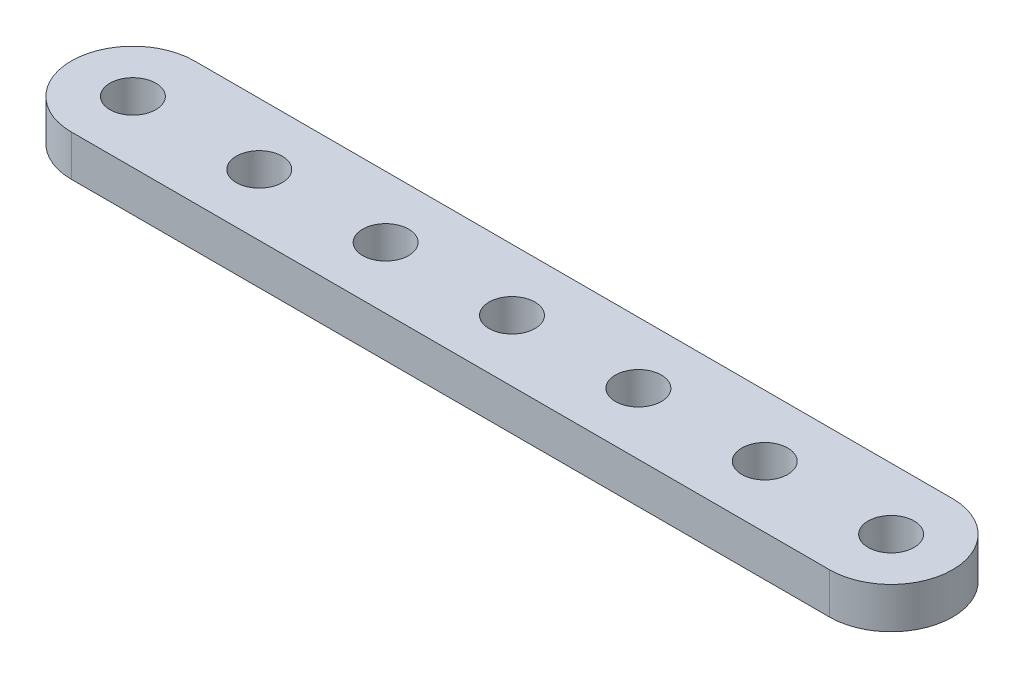
ISO-10303-21;
HEADER;
FILE_DESCRIPTION(('STEP AP214'),'2;1');
FILE_NAME('part.step','',(''),(''),'','','');
FILE_SCHEMA(('AUTOMOTIVE_DESIGN { 1 0 10303 214 1 1 1 1 }'));
ENDSEC;
DATA;
#1=APPLICATION_CONTEXT('core data for automotive mechanical design processes');
#2=APPLICATION_PROTOCOL_DEFINITION('international standard','automotive_design',2000,#1);
#3=PRODUCT_CONTEXT('',#1,'mechanical');
#4=PRODUCT('Part','Part','',(#3));
#5=PRODUCT_RELATED_PRODUCT_CATEGORY('part','',(#4));
#6=PRODUCT_DEFINITION_FORMATION('','',#4);
#7=PRODUCT_DEFINITION_CONTEXT('part definition',#1,'design');
#8=PRODUCT_DEFINITION('design','',#6,#7);
#9=PRODUCT_DEFINITION_SHAPE('','',#8);
#10=(LENGTH_UNIT() NAMED_UNIT(*) SI_UNIT(.MILLI.,.METRE.));
#11=(NAMED_UNIT(*) PLANE_ANGLE_UNIT() SI_UNIT($,.RADIAN.));
#12=(NAMED_UNIT(*) SI_UNIT($,.STERADIAN.) SOLID_ANGLE_UNIT());
#13=UNCERTAINTY_MEASURE_WITH_UNIT(LENGTH_MEASURE(1.E-05),#10,'distance_accuracy_value','');
#14=(GEOMETRIC_REPRESENTATION_CONTEXT(3) GLOBAL_UNCERTAINTY_ASSIGNED_CONTEXT((#13)) GLOBAL_UNIT_ASSIGNED_CONTEXT((#10,
#11,#12)) REPRESENTATION_CONTEXT('',''));
#15=CARTESIAN_POINT('',(0.,0.,0.));
#16=DIRECTION('',(0.,0.,1.));
#17=DIRECTION('',(1.,0.,0.));
#18=AXIS2_PLACEMENT_3D('',#15,#16,#17);
#19=CARTESIAN_POINT('',(-29.337,6.35,0.));
#20=DIRECTION('',(0.,-1.,0.));
#21=DIRECTION('',(0.,0.,-1.));
#22=AXIS2_PLACEMENT_3D('',#19,#20,#21);
#23=CYLINDRICAL_SURFACE('',#22,4.76250000000001);
#24=CARTESIAN_POINT('',(-29.337,3.175,0.));
#25=DIRECTION('',(0.,-1.,0.));
#26=DIRECTION('',(0.,0.,-1.));
#27=AXIS2_PLACEMENT_3D('',#24,#25,#26);
#28=CIRCLE('',#27,4.76250000000001);
#29=CARTESIAN_POINT('',(-29.337,3.175,-4.76250000000001));
#30=VERTEX_POINT('',#29);
#31=CARTESIAN_POINT('',(-29.337,3.175,4.76250000000001));
#32=VERTEX_POINT('',#31);
#33=EDGE_CURVE('E79',#30,#32,#28,.F.);
#34=ORIENTED_EDGE('',*,*,#33,.F.);
#35=DIRECTION('',(0.,-1.,0.));
#36=VECTOR('',#35,1.);
#37=CARTESIAN_POINT('',(-29.337,6.35,-4.76250000000001));
#38=LINE('',#37,#36);
#39=CARTESIAN_POINT('',(-29.337,0.,-4.76250000000001));
#40=VERTEX_POINT('',#39);
#41=EDGE_CURVE('E86',#30,#40,#38,.T.);
#42=ORIENTED_EDGE('',*,*,#41,.T.);
#43=CARTESIAN_POINT('',(-29.337,0.,0.));
#44=DIRECTION('',(0.,-1.,0.));
#45=DIRECTION('',(0.,0.,-1.));
#46=AXIS2_PLACEMENT_3D('',#43,#44,#45);
#47=CIRCLE('',#46,4.76250000000001);
#48=CARTESIAN_POINT('',(-29.337,0.,4.76250000000001));
#49=VERTEX_POINT('',#48);
#50=EDGE_CURVE('E106',#49,#40,#47,.T.);
#51=ORIENTED_EDGE('',*,*,#50,.F.);
#52=DIRECTION('',(0.,-1.,0.));
#53=VECTOR('',#52,1.);
#54=CARTESIAN_POINT('',(-29.337,6.35,4.76250000000001));
#55=LINE('',#54,#53);
#56=EDGE_CURVE('E11',#32,#49,#55,.T.);
#57=ORIENTED_EDGE('',*,*,#56,.F.);
#58=EDGE_LOOP('',(#34,#42,#51,#57));
#59=FACE_BOUND('',#58,.T.);
#60=ADVANCED_FACE('F36',(#59),#23,.T.);
#61=CARTESIAN_POINT('',(29.337,6.35,4.76250000000001));
#62=DIRECTION('',(0.,0.,1.));
#63=DIRECTION('',(1.,0.,0.));
#64=AXIS2_PLACEMENT_3D('',#61,#62,#63);
#65=PLANE('',#64);
#66=DIRECTION('',(1.,0.,0.));
#67=VECTOR('',#66,1.);
#68=CARTESIAN_POINT('',(29.337,3.175,4.76250000000001));
#69=LINE('',#68,#67);
#70=CARTESIAN_POINT('',(29.337,3.175,4.76250000000001));
#71=VERTEX_POINT('',#70);
#72=EDGE_CURVE('E89',#32,#71,#69,.T.);
#73=ORIENTED_EDGE('',*,*,#72,.F.);
#74=ORIENTED_EDGE('',*,*,#56,.T.);
#75=DIRECTION('',(-1.,0.,0.));
#76=VECTOR('',#75,1.);
#77=CARTESIAN_POINT('',(29.337,0.,4.76250000000001));
#78=LINE('',#77,#76);
#79=CARTESIAN_POINT('',(29.337,0.,4.76250000000001));
#80=VERTEX_POINT('',#79);
#81=EDGE_CURVE('E96',#80,#49,#78,.T.);
#82=ORIENTED_EDGE('',*,*,#81,.F.);
#83=DIRECTION('',(0.,-1.,0.));
#84=VECTOR('',#83,1.);
#85=CARTESIAN_POINT('',(29.337,6.35,4.76250000000001));
#86=LINE('',#85,#84);
#87=EDGE_CURVE('E44',#71,#80,#86,.T.);
#88=ORIENTED_EDGE('',*,*,#87,.F.);
#89=EDGE_LOOP('',(#73,#74,#82,#88));
#90=FACE_BOUND('',#89,.T.);
#91=ADVANCED_FACE('F177',(#90),#65,.T.);
#92=CARTESIAN_POINT('',(29.337,6.35,0.));
#93=DIRECTION('',(0.,-1.,0.));
#94=DIRECTION('',(0.,0.,-1.));
#95=AXIS2_PLACEMENT_3D('',#92,#93,#94);
#96=CYLINDRICAL_SURFACE('',#95,4.76250000000001);
#97=CARTESIAN_POINT('',(29.337,3.175,0.));
#98=DIRECTION('',(0.,-1.,0.));
#99=DIRECTION('',(0.,0.,-1.));
#100=AXIS2_PLACEMENT_3D('',#97,#98,#99);
#101=CIRCLE('',#100,4.76250000000001);
#102=CARTESIAN_POINT('',(29.337,3.175,-4.76250000000001));
#103=VERTEX_POINT('',#102);
#104=EDGE_CURVE('E52',#71,#103,#101,.F.);
#105=ORIENTED_EDGE('',*,*,#104,.F.);
#106=ORIENTED_EDGE('',*,*,#87,.T.);
#107=CARTESIAN_POINT('',(29.337,0.,0.));
#108=DIRECTION('',(0.,-1.,0.));
#109=DIRECTION('',(0.,0.,-1.));
#110=AXIS2_PLACEMENT_3D('',#107,#108,#109);
#111=CIRCLE('',#110,4.76250000000001);
#112=CARTESIAN_POINT('',(29.337,0.,-4.76250000000001));
#113=VERTEX_POINT('',#112);
#114=EDGE_CURVE('E99',#113,#80,#111,.T.);
#115=ORIENTED_EDGE('',*,*,#114,.F.);
#116=DIRECTION('',(0.,-1.,0.));
#117=VECTOR('',#116,1.);
#118=CARTESIAN_POINT('',(29.337,6.35,-4.76250000000001));
#119=LINE('',#118,#117);
#120=EDGE_CURVE('E95',#103,#113,#119,.T.);
#121=ORIENTED_EDGE('',*,*,#120,.F.);
#122=EDGE_LOOP('',(#105,#106,#115,#121));
#123=FACE_BOUND('',#122,.T.);
#124=ADVANCED_FACE('F179',(#123),#96,.T.);
#125=CARTESIAN_POINT('',(-29.337,6.35,-4.76250000000001));
#126=DIRECTION('',(0.,0.,-1.));
#127=DIRECTION('',(-1.,0.,0.));
#128=AXIS2_PLACEMENT_3D('',#125,#126,#127);
#129=PLANE('',#128);
#130=DIRECTION('',(-1.,0.,0.));
#131=VECTOR('',#130,1.);
#132=CARTESIAN_POINT('',(-29.337,3.175,-4.76250000000001));
#133=LINE('',#132,#131);
#134=EDGE_CURVE('E75',#103,#30,#133,.T.);
#135=ORIENTED_EDGE('',*,*,#134,.F.);
#136=ORIENTED_EDGE('',*,*,#120,.T.);
#137=DIRECTION('',(1.,0.,0.));
#138=VECTOR('',#137,1.);
#139=CARTESIAN_POINT('',(-29.337,0.,-4.76250000000001));
#140=LINE('',#139,#138);
#141=EDGE_CURVE('E93',#40,#113,#140,.T.);
#142=ORIENTED_EDGE('',*,*,#141,.F.);
#143=ORIENTED_EDGE('',*,*,#41,.F.);
#144=EDGE_LOOP('',(#135,#136,#142,#143));
#145=FACE_BOUND('',#144,.T.);
#146=ADVANCED_FACE('F91',(#145),#129,.T.);
#147=CARTESIAN_POINT('',(-29.337,0.,0.));
#148=DIRECTION('',(0.,-1.,0.));
#149=DIRECTION('',(0.,0.,-1.));
#150=AXIS2_PLACEMENT_3D('',#147,#148,#149);
#151=PLANE('',#150);
#152=CARTESIAN_POINT('',(-29.337,0.,0.));
#153=DIRECTION('',(0.,-1.,0.));
#154=DIRECTION('',(0.,0.,1.));
#155=AXIS2_PLACEMENT_3D('',#152,#153,#154);
#156=CIRCLE('',#155,1.77799999999998);
#157=CARTESIAN_POINT('',(-29.337,0.,1.77799999999999));
#158=VERTEX_POINT('',#157);
#159=EDGE_CURVE('E88',#158,#158,#156,.T.);
#160=ORIENTED_EDGE('',*,*,#159,.F.);
#161=EDGE_LOOP('',(#160));
#162=FACE_BOUND('',#161,.T.);
#163=CARTESIAN_POINT('',(-19.558,0.,0.));
#164=DIRECTION('',(0.,-1.,0.));
#165=DIRECTION('',(0.,0.,1.));
#166=AXIS2_PLACEMENT_3D('',#163,#164,#165);
#167=CIRCLE('',#166,1.77799999999999);
#168=CARTESIAN_POINT('',(-19.558,0.,1.77799999999999));
#169=VERTEX_POINT('',#168);
#170=EDGE_CURVE('E123',#169,#169,#167,.T.);
#171=ORIENTED_EDGE('',*,*,#170,.F.);
#172=EDGE_LOOP('',(#171));
#173=FACE_BOUND('',#172,.T.);
#174=CARTESIAN_POINT('',(-9.779,0.,0.));
#175=DIRECTION('',(0.,-1.,0.));
#176=DIRECTION('',(0.,0.,1.));
#177=AXIS2_PLACEMENT_3D('',#174,#175,#176);
#178=CIRCLE('',#177,1.77799999999999);
#179=CARTESIAN_POINT('',(-9.779,0.,1.77799999999999));
#180=VERTEX_POINT('',#179);
#181=EDGE_CURVE('E120',#180,#180,#178,.T.);
#182=ORIENTED_EDGE('',*,*,#181,.F.);
#183=EDGE_LOOP('',(#182));
#184=FACE_BOUND('',#183,.T.);
#185=CARTESIAN_POINT('',(0.,0.,0.));
#186=DIRECTION('',(0.,-1.,0.));
#187=DIRECTION('',(0.,0.,1.));
#188=AXIS2_PLACEMENT_3D('',#185,#186,#187);
#189=CIRCLE('',#188,1.77799999999999);
#190=CARTESIAN_POINT('',(0.,0.,1.77799999999999));
#191=VERTEX_POINT('',#190);
#192=EDGE_CURVE('E117',#191,#191,#189,.T.);
#193=ORIENTED_EDGE('',*,*,#192,.F.);
#194=EDGE_LOOP('',(#193));
#195=FACE_BOUND('',#194,.T.);
#196=CARTESIAN_POINT('',(9.779,0.,0.));
#197=DIRECTION('',(0.,-1.,0.));
#198=DIRECTION('',(0.,0.,1.));
#199=AXIS2_PLACEMENT_3D('',#196,#197,#198);
#200=CIRCLE('',#199,1.77799999999999);
#201=CARTESIAN_POINT('',(9.779,0.,1.77799999999999));
#202=VERTEX_POINT('',#201);
#203=EDGE_CURVE('E114',#202,#202,#200,.T.);
#204=ORIENTED_EDGE('',*,*,#203,.F.);
#205=EDGE_LOOP('',(#204));
#206=FACE_BOUND('',#205,.T.);
#207=CARTESIAN_POINT('',(19.558,0.,0.));
#208=DIRECTION('',(0.,-1.,0.));
#209=DIRECTION('',(0.,0.,1.));
#210=AXIS2_PLACEMENT_3D('',#207,#208,#209);
#211=CIRCLE('',#210,1.77799999999999);
#212=CARTESIAN_POINT('',(19.558,0.,1.77799999999999));
#213=VERTEX_POINT('',#212);
#214=EDGE_CURVE('E111',#213,#213,#211,.T.);
#215=ORIENTED_EDGE('',*,*,#214,.F.);
#216=EDGE_LOOP('',(#215));
#217=FACE_BOUND('',#216,.T.);
#218=CARTESIAN_POINT('',(29.337,0.,0.));
#219=DIRECTION('',(0.,-1.,0.));
#220=DIRECTION('',(0.,0.,1.));
#221=AXIS2_PLACEMENT_3D('',#218,#219,#220);
#222=CIRCLE('',#221,1.77799999999999);
#223=CARTESIAN_POINT('',(29.337,0.,1.77799999999999));
#224=VERTEX_POINT('',#223);
#225=EDGE_CURVE('E108',#224,#224,#222,.T.);
#226=ORIENTED_EDGE('',*,*,#225,.F.);
#227=EDGE_LOOP('',(#226));
#228=FACE_BOUND('',#227,.T.);
#229=ORIENTED_EDGE('',*,*,#50,.T.);
#230=ORIENTED_EDGE('',*,*,#141,.T.);
#231=ORIENTED_EDGE('',*,*,#114,.T.);
#232=ORIENTED_EDGE('',*,*,#81,.T.);
#233=EDGE_LOOP('',(#229,#230,#231,#232));
#234=FACE_BOUND('',#233,.T.);
#235=ADVANCED_FACE('F167',(#162,#173,#184,#195,#206,#217,#228,#234),#151,.T.);
#236=CARTESIAN_POINT('',(29.337,6.35,0.));
#237=DIRECTION('',(0.,-1.,0.));
#238=DIRECTION('',(0.,0.,-1.));
#239=AXIS2_PLACEMENT_3D('',#236,#237,#238);
#240=CYLINDRICAL_SURFACE('',#239,1.77799999999999);
#241=CARTESIAN_POINT('',(29.337,3.175,0.));
#242=DIRECTION('',(0.,-1.,0.));
#243=DIRECTION('',(0.,0.,-1.));
#244=AXIS2_PLACEMENT_3D('',#241,#242,#243);
#245=CIRCLE('',#244,1.77799999999999);
#246=CARTESIAN_POINT('',(29.337,3.175,-1.77799999999998));
#247=VERTEX_POINT('',#246);
#248=EDGE_CURVE('E83',#247,#247,#245,.F.);
#249=ORIENTED_EDGE('',*,*,#248,.T.);
#250=EDGE_LOOP('',(#249));
#251=FACE_BOUND('',#250,.T.);
#252=ORIENTED_EDGE('',*,*,#225,.T.);
#253=EDGE_LOOP('',(#252));
#254=FACE_BOUND('',#253,.T.);
#255=ADVANCED_FACE('F163',(#251,#254),#240,.F.);
#256=CARTESIAN_POINT('',(19.558,6.35,0.));
#257=DIRECTION('',(0.,-1.,0.));
#258=DIRECTION('',(0.,0.,-1.));
#259=AXIS2_PLACEMENT_3D('',#256,#257,#258);
#260=CYLINDRICAL_SURFACE('',#259,1.77799999999999);
#261=CARTESIAN_POINT('',(19.558,3.175,0.));
#262=DIRECTION('',(0.,-1.,0.));
#263=DIRECTION('',(0.,0.,-1.));
#264=AXIS2_PLACEMENT_3D('',#261,#262,#263);
#265=CIRCLE('',#264,1.77799999999999);
#266=CARTESIAN_POINT('',(19.558,3.175,-1.77799999999998));
#267=VERTEX_POINT('',#266);
#268=EDGE_CURVE('E132',#267,#267,#265,.F.);
#269=ORIENTED_EDGE('',*,*,#268,.T.);
#270=EDGE_LOOP('',(#269));
#271=FACE_BOUND('',#270,.T.);
#272=ORIENTED_EDGE('',*,*,#214,.T.);
#273=EDGE_LOOP('',(#272));
#274=FACE_BOUND('',#273,.T.);
#275=ADVANCED_FACE('F166',(#271,#274),#260,.F.);
#276=CARTESIAN_POINT('',(9.779,6.35,0.));
#277=DIRECTION('',(0.,-1.,0.));
#278=DIRECTION('',(0.,0.,-1.));
#279=AXIS2_PLACEMENT_3D('',#276,#277,#278);
#280=CYLINDRICAL_SURFACE('',#279,1.77799999999999);
#281=CARTESIAN_POINT('',(9.779,3.175,0.));
#282=DIRECTION('',(0.,-1.,0.));
#283=DIRECTION('',(0.,0.,-1.));
#284=AXIS2_PLACEMENT_3D('',#281,#282,#283);
#285=CIRCLE('',#284,1.77799999999999);
#286=CARTESIAN_POINT('',(9.779,3.175,-1.77799999999998));
#287=VERTEX_POINT('',#286);
#288=EDGE_CURVE('E135',#287,#287,#285,.F.);
#289=ORIENTED_EDGE('',*,*,#288,.T.);
#290=EDGE_LOOP('',(#289));
#291=FACE_BOUND('',#290,.T.);
#292=ORIENTED_EDGE('',*,*,#203,.T.);
#293=EDGE_LOOP('',(#292));
#294=FACE_BOUND('',#293,.T.);
#295=ADVANCED_FACE('F223',(#291,#294),#280,.F.);
#296=CARTESIAN_POINT('',(0.,6.35,0.));
#297=DIRECTION('',(0.,-1.,0.));
#298=DIRECTION('',(0.,0.,-1.));
#299=AXIS2_PLACEMENT_3D('',#296,#297,#298);
#300=CYLINDRICAL_SURFACE('',#299,1.77799999999999);
#301=CARTESIAN_POINT('',(0.,3.175,0.));
#302=DIRECTION('',(0.,-1.,0.));
#303=DIRECTION('',(0.,0.,-1.));
#304=AXIS2_PLACEMENT_3D('',#301,#302,#303);
#305=CIRCLE('',#304,1.77799999999999);
#306=CARTESIAN_POINT('',(0.,3.175,-1.77799999999998));
#307=VERTEX_POINT('',#306);
#308=EDGE_CURVE('E138',#307,#307,#305,.F.);
#309=ORIENTED_EDGE('',*,*,#308,.T.);
#310=EDGE_LOOP('',(#309));
#311=FACE_BOUND('',#310,.T.);
#312=ORIENTED_EDGE('',*,*,#192,.T.);
#313=EDGE_LOOP('',(#312));
#314=FACE_BOUND('',#313,.T.);
#315=ADVANCED_FACE('F233',(#311,#314),#300,.F.);
#316=CARTESIAN_POINT('',(-9.779,6.35,0.));
#317=DIRECTION('',(0.,-1.,0.));
#318=DIRECTION('',(0.,0.,-1.));
#319=AXIS2_PLACEMENT_3D('',#316,#317,#318);
#320=CYLINDRICAL_SURFACE('',#319,1.77799999999999);
#321=CARTESIAN_POINT('',(-9.779,3.175,0.));
#322=DIRECTION('',(0.,-1.,0.));
#323=DIRECTION('',(0.,0.,-1.));
#324=AXIS2_PLACEMENT_3D('',#321,#322,#323);
#325=CIRCLE('',#324,1.77799999999999);
#326=CARTESIAN_POINT('',(-9.779,3.175,-1.77799999999999));
#327=VERTEX_POINT('',#326);
#328=EDGE_CURVE('E141',#327,#327,#325,.F.);
#329=ORIENTED_EDGE('',*,*,#328,.T.);
#330=EDGE_LOOP('',(#329));
#331=FACE_BOUND('',#330,.T.);
#332=ORIENTED_EDGE('',*,*,#181,.T.);
#333=EDGE_LOOP('',(#332));
#334=FACE_BOUND('',#333,.T.);
#335=ADVANCED_FACE('F243',(#331,#334),#320,.F.);
#336=CARTESIAN_POINT('',(-19.558,6.35,0.));
#337=DIRECTION('',(0.,-1.,0.));
#338=DIRECTION('',(0.,0.,-1.));
#339=AXIS2_PLACEMENT_3D('',#336,#337,#338);
#340=CYLINDRICAL_SURFACE('',#339,1.77799999999999);
#341=CARTESIAN_POINT('',(-19.558,3.175,0.));
#342=DIRECTION('',(0.,-1.,0.));
#343=DIRECTION('',(0.,0.,-1.));
#344=AXIS2_PLACEMENT_3D('',#341,#342,#343);
#345=CIRCLE('',#344,1.77799999999999);
#346=CARTESIAN_POINT('',(-19.558,3.175,-1.77799999999999));
#347=VERTEX_POINT('',#346);
#348=EDGE_CURVE('E144',#347,#347,#345,.F.);
#349=ORIENTED_EDGE('',*,*,#348,.T.);
#350=EDGE_LOOP('',(#349));
#351=FACE_BOUND('',#350,.T.);
#352=ORIENTED_EDGE('',*,*,#170,.T.);
#353=EDGE_LOOP('',(#352));
#354=FACE_BOUND('',#353,.T.);
#355=ADVANCED_FACE('F253',(#351,#354),#340,.F.);
#356=CARTESIAN_POINT('',(-29.337,6.35,0.));
#357=DIRECTION('',(0.,-1.,0.));
#358=DIRECTION('',(0.,0.,-1.));
#359=AXIS2_PLACEMENT_3D('',#356,#357,#358);
#360=CYLINDRICAL_SURFACE('',#359,1.77799999999998);
#361=CARTESIAN_POINT('',(-29.337,3.175,0.));
#362=DIRECTION('',(0.,-1.,0.));
#363=DIRECTION('',(0.,0.,-1.));
#364=AXIS2_PLACEMENT_3D('',#361,#362,#363);
#365=CIRCLE('',#364,1.77799999999998);
#366=CARTESIAN_POINT('',(-29.337,3.175,-1.77799999999998));
#367=VERTEX_POINT('',#366);
#368=EDGE_CURVE('E39',#367,#367,#365,.F.);
#369=ORIENTED_EDGE('',*,*,#368,.T.);
#370=EDGE_LOOP('',(#369));
#371=FACE_BOUND('',#370,.T.);
#372=ORIENTED_EDGE('',*,*,#159,.T.);
#373=EDGE_LOOP('',(#372));
#374=FACE_BOUND('',#373,.T.);
#375=ADVANCED_FACE('F151',(#371,#374),#360,.F.);
#376=CARTESIAN_POINT('',(0.,3.175,0.));
#377=DIRECTION('',(0.,-1.,0.));
#378=DIRECTION('',(0.,0.,-1.));
#379=AXIS2_PLACEMENT_3D('',#376,#377,#378);
#380=PLANE('',#379);
#381=ORIENTED_EDGE('',*,*,#33,.T.);
#382=ORIENTED_EDGE('',*,*,#72,.T.);
#383=ORIENTED_EDGE('',*,*,#104,.T.);
#384=ORIENTED_EDGE('',*,*,#134,.T.);
#385=EDGE_LOOP('',(#381,#382,#383,#384));
#386=FACE_BOUND('',#385,.T.);
#387=ORIENTED_EDGE('',*,*,#268,.F.);
#388=EDGE_LOOP('',(#387));
#389=FACE_BOUND('',#388,.T.);
#390=ORIENTED_EDGE('',*,*,#308,.F.);
#391=EDGE_LOOP('',(#390));
#392=FACE_BOUND('',#391,.T.);
#393=ORIENTED_EDGE('',*,*,#348,.F.);
#394=EDGE_LOOP('',(#393));
#395=FACE_BOUND('',#394,.T.);
#396=ORIENTED_EDGE('',*,*,#368,.F.);
#397=EDGE_LOOP('',(#396));
#398=FACE_BOUND('',#397,.T.);
#399=ORIENTED_EDGE('',*,*,#328,.F.);
#400=EDGE_LOOP('',(#399));
#401=FACE_BOUND('',#400,.T.);
#402=ORIENTED_EDGE('',*,*,#288,.F.);
#403=EDGE_LOOP('',(#402));
#404=FACE_BOUND('',#403,.T.);
#405=ORIENTED_EDGE('',*,*,#248,.F.);
#406=EDGE_LOOP('',(#405));
#407=FACE_BOUND('',#406,.T.);
#408=ADVANCED_FACE('F77',(#386,#389,#392,#395,#398,#401,#404,#407),#380,.F.);
#409=CLOSED_SHELL('',(#60,#91,#124,#146,#235,#255,#275,#295,#315,#335,#355,#375,#408));
#410=MANIFOLD_SOLID_BREP('B2',#409);
#411=ADVANCED_BREP_SHAPE_REPRESENTATION('',(#18,#410),#14);
#412=SHAPE_DEFINITION_REPRESENTATION(#9,#411);
ENDSEC;
END-ISO-10303-21;
